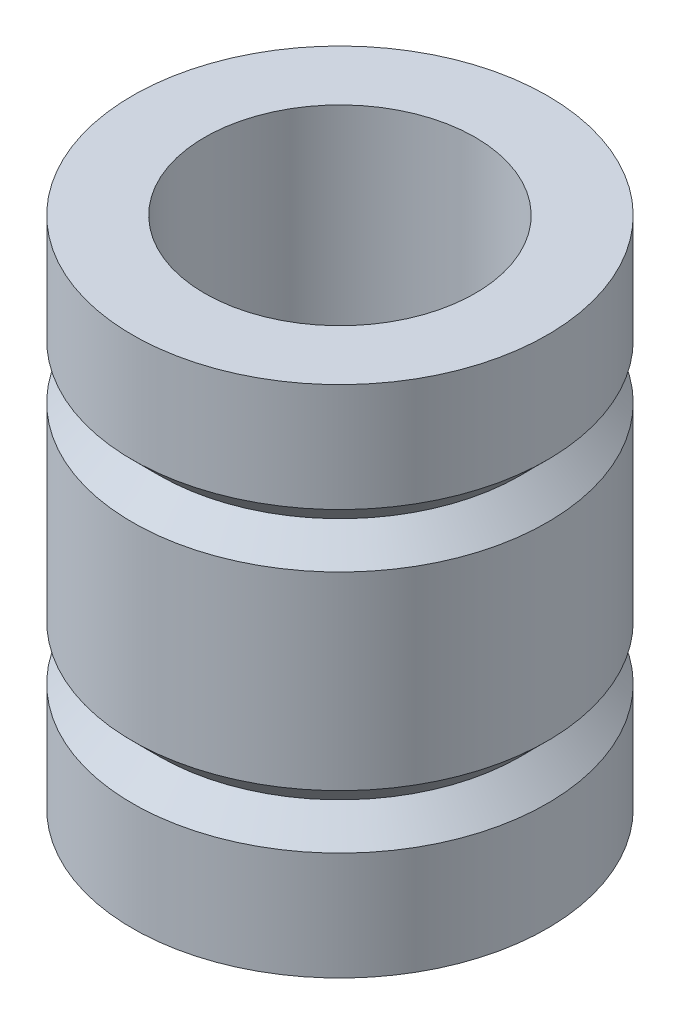
ISO-10303-21;
HEADER;
FILE_DESCRIPTION(('STEP AP214'),'2;1');
FILE_NAME('part.step','',(''),(''),'','','');
FILE_SCHEMA(('AUTOMOTIVE_DESIGN { 1 0 10303 214 1 1 1 1 }'));
ENDSEC;
DATA;
#1=APPLICATION_CONTEXT('core data for automotive mechanical design processes');
#2=APPLICATION_PROTOCOL_DEFINITION('international standard','automotive_design',2000,#1);
#3=PRODUCT_CONTEXT('',#1,'mechanical');
#4=PRODUCT('Part','Part','',(#3));
#5=PRODUCT_RELATED_PRODUCT_CATEGORY('part','',(#4));
#6=PRODUCT_DEFINITION_FORMATION('','',#4);
#7=PRODUCT_DEFINITION_CONTEXT('part definition',#1,'design');
#8=PRODUCT_DEFINITION('design','',#6,#7);
#9=PRODUCT_DEFINITION_SHAPE('','',#8);
#10=(LENGTH_UNIT() NAMED_UNIT(*) SI_UNIT(.MILLI.,.METRE.));
#11=(NAMED_UNIT(*) PLANE_ANGLE_UNIT() SI_UNIT($,.RADIAN.));
#12=(NAMED_UNIT(*) SI_UNIT($,.STERADIAN.) SOLID_ANGLE_UNIT());
#13=UNCERTAINTY_MEASURE_WITH_UNIT(LENGTH_MEASURE(1.E-05),#10,'distance_accuracy_value','');
#14=(GEOMETRIC_REPRESENTATION_CONTEXT(3) GLOBAL_UNCERTAINTY_ASSIGNED_CONTEXT((#13)) GLOBAL_UNIT_ASSIGNED_CONTEXT((#10,
#11,#12)) REPRESENTATION_CONTEXT('',''));
#15=CARTESIAN_POINT('',(0.,0.,0.));
#16=DIRECTION('',(0.,0.,1.));
#17=DIRECTION('',(1.,0.,0.));
#18=AXIS2_PLACEMENT_3D('',#15,#16,#17);
#19=CARTESIAN_POINT('',(0.,-10.,0.));
#20=DIRECTION('',(0.,-1.,0.));
#21=DIRECTION('',(0.,0.,-1.));
#22=AXIS2_PLACEMENT_3D('',#19,#20,#21);
#23=CYLINDRICAL_SURFACE('',#22,1.5);
#24=CARTESIAN_POINT('',(0.,-5.7,0.));
#25=DIRECTION('',(0.,-1.,0.));
#26=DIRECTION('',(0.,0.,-1.));
#27=AXIS2_PLACEMENT_3D('',#24,#25,#26);
#28=CIRCLE('',#27,1.5);
#29=CARTESIAN_POINT('',(0.,-5.7,-1.5));
#30=VERTEX_POINT('',#29);
#31=EDGE_CURVE('E73',#30,#30,#28,.T.);
#32=ORIENTED_EDGE('',*,*,#31,.T.);
#33=EDGE_LOOP('',(#32));
#34=FACE_BOUND('',#33,.T.);
#35=CARTESIAN_POINT('',(0.,0.,0.));
#36=DIRECTION('',(0.,-1.,0.));
#37=DIRECTION('',(0.,0.,-1.));
#38=AXIS2_PLACEMENT_3D('',#35,#36,#37);
#39=CIRCLE('',#38,1.5);
#40=CARTESIAN_POINT('',(0.,0.,-1.5));
#41=VERTEX_POINT('',#40);
#42=EDGE_CURVE('E10',#41,#41,#39,.T.);
#43=ORIENTED_EDGE('',*,*,#42,.F.);
#44=EDGE_LOOP('',(#43));
#45=FACE_BOUND('',#44,.T.);
#46=ADVANCED_FACE('F39',(#34,#45),#23,.F.);
#47=CARTESIAN_POINT('',(1.5,0.,0.));
#48=DIRECTION('',(0.,1.,0.));
#49=DIRECTION('',(0.,0.,1.));
#50=AXIS2_PLACEMENT_3D('',#47,#48,#49);
#51=PLANE('',#50);
#52=ORIENTED_EDGE('',*,*,#42,.T.);
#53=EDGE_LOOP('',(#52));
#54=FACE_BOUND('',#53,.T.);
#55=CARTESIAN_POINT('',(0.,0.,0.));
#56=DIRECTION('',(0.,-1.,0.));
#57=DIRECTION('',(0.,0.,-1.));
#58=AXIS2_PLACEMENT_3D('',#55,#56,#57);
#59=CIRCLE('',#58,2.3);
#60=CARTESIAN_POINT('',(0.,0.,-2.3));
#61=VERTEX_POINT('',#60);
#62=EDGE_CURVE('E45',#61,#61,#59,.T.);
#63=ORIENTED_EDGE('',*,*,#62,.F.);
#64=EDGE_LOOP('',(#63));
#65=FACE_BOUND('',#64,.T.);
#66=ADVANCED_FACE('F91',(#54,#65),#51,.T.);
#67=CARTESIAN_POINT('',(0.,-10.,0.));
#68=DIRECTION('',(0.,-1.,0.));
#69=DIRECTION('',(0.,0.,-1.));
#70=AXIS2_PLACEMENT_3D('',#67,#68,#69);
#71=CYLINDRICAL_SURFACE('',#70,2.3);
#72=ORIENTED_EDGE('',*,*,#62,.T.);
#73=EDGE_LOOP('',(#72));
#74=FACE_BOUND('',#73,.T.);
#75=CARTESIAN_POINT('',(0.,-1.2,0.));
#76=DIRECTION('',(0.,-1.,0.));
#77=DIRECTION('',(0.,0.,-1.));
#78=AXIS2_PLACEMENT_3D('',#75,#76,#77);
#79=CIRCLE('',#78,2.3);
#80=CARTESIAN_POINT('',(0.,-1.2,-2.3));
#81=VERTEX_POINT('',#80);
#82=EDGE_CURVE('E49',#81,#81,#79,.T.);
#83=ORIENTED_EDGE('',*,*,#82,.F.);
#84=EDGE_LOOP('',(#83));
#85=FACE_BOUND('',#84,.T.);
#86=ADVANCED_FACE('F95',(#74,#85),#71,.T.);
#87=CARTESIAN_POINT('',(0.,-1.5,0.));
#88=DIRECTION('',(0.,1.,0.));
#89=DIRECTION('',(0.,0.,1.));
#90=AXIS2_PLACEMENT_3D('',#87,#88,#89);
#91=CONICAL_SURFACE('',#90,2.,0.785398163397448);
#92=ORIENTED_EDGE('',*,*,#82,.T.);
#93=EDGE_LOOP('',(#92));
#94=FACE_BOUND('',#93,.T.);
#95=CARTESIAN_POINT('',(0.,-1.5,0.));
#96=DIRECTION('',(0.,-1.,0.));
#97=DIRECTION('',(0.,0.,-1.));
#98=AXIS2_PLACEMENT_3D('',#95,#96,#97);
#99=CIRCLE('',#98,2.);
#100=CARTESIAN_POINT('',(0.,-1.5,-2.));
#101=VERTEX_POINT('',#100);
#102=EDGE_CURVE('E53',#101,#101,#99,.T.);
#103=ORIENTED_EDGE('',*,*,#102,.F.);
#104=EDGE_LOOP('',(#103));
#105=FACE_BOUND('',#104,.T.);
#106=ADVANCED_FACE('F99',(#94,#105),#91,.T.);
#107=CARTESIAN_POINT('',(0.,-1.8,0.));
#108=DIRECTION('',(0.,-1.,0.));
#109=DIRECTION('',(0.,0.,-1.));
#110=AXIS2_PLACEMENT_3D('',#107,#108,#109);
#111=CONICAL_SURFACE('',#110,2.3,0.785398163397448);
#112=ORIENTED_EDGE('',*,*,#102,.T.);
#113=EDGE_LOOP('',(#112));
#114=FACE_BOUND('',#113,.T.);
#115=CARTESIAN_POINT('',(0.,-1.8,0.));
#116=DIRECTION('',(0.,-1.,0.));
#117=DIRECTION('',(0.,0.,-1.));
#118=AXIS2_PLACEMENT_3D('',#115,#116,#117);
#119=CIRCLE('',#118,2.3);
#120=CARTESIAN_POINT('',(0.,-1.8,-2.3));
#121=VERTEX_POINT('',#120);
#122=EDGE_CURVE('E58',#121,#121,#119,.T.);
#123=ORIENTED_EDGE('',*,*,#122,.F.);
#124=EDGE_LOOP('',(#123));
#125=FACE_BOUND('',#124,.T.);
#126=ADVANCED_FACE('F105',(#114,#125),#111,.T.);
#127=CARTESIAN_POINT('',(0.,-10.,0.));
#128=DIRECTION('',(0.,-1.,0.));
#129=DIRECTION('',(0.,0.,-1.));
#130=AXIS2_PLACEMENT_3D('',#127,#128,#129);
#131=CYLINDRICAL_SURFACE('',#130,2.3);
#132=ORIENTED_EDGE('',*,*,#122,.T.);
#133=EDGE_LOOP('',(#132));
#134=FACE_BOUND('',#133,.T.);
#135=CARTESIAN_POINT('',(0.,-3.9,0.));
#136=DIRECTION('',(0.,-1.,0.));
#137=DIRECTION('',(0.,0.,-1.));
#138=AXIS2_PLACEMENT_3D('',#135,#136,#137);
#139=CIRCLE('',#138,2.3);
#140=CARTESIAN_POINT('',(0.,-3.9,-2.3));
#141=VERTEX_POINT('',#140);
#142=EDGE_CURVE('E61',#141,#141,#139,.T.);
#143=ORIENTED_EDGE('',*,*,#142,.F.);
#144=EDGE_LOOP('',(#143));
#145=FACE_BOUND('',#144,.T.);
#146=ADVANCED_FACE('F109',(#134,#145),#131,.T.);
#147=CARTESIAN_POINT('',(0.,-4.2,0.));
#148=DIRECTION('',(0.,1.,0.));
#149=DIRECTION('',(0.,0.,1.));
#150=AXIS2_PLACEMENT_3D('',#147,#148,#149);
#151=CONICAL_SURFACE('',#150,2.,0.785398163397448);
#152=ORIENTED_EDGE('',*,*,#142,.T.);
#153=EDGE_LOOP('',(#152));
#154=FACE_BOUND('',#153,.T.);
#155=CARTESIAN_POINT('',(0.,-4.2,0.));
#156=DIRECTION('',(0.,-1.,0.));
#157=DIRECTION('',(0.,0.,-1.));
#158=AXIS2_PLACEMENT_3D('',#155,#156,#157);
#159=CIRCLE('',#158,2.);
#160=CARTESIAN_POINT('',(0.,-4.2,-2.));
#161=VERTEX_POINT('',#160);
#162=EDGE_CURVE('E64',#161,#161,#159,.T.);
#163=ORIENTED_EDGE('',*,*,#162,.F.);
#164=EDGE_LOOP('',(#163));
#165=FACE_BOUND('',#164,.T.);
#166=ADVANCED_FACE('F113',(#154,#165),#151,.T.);
#167=CARTESIAN_POINT('',(0.,-4.5,0.));
#168=DIRECTION('',(0.,-1.,0.));
#169=DIRECTION('',(0.,0.,-1.));
#170=AXIS2_PLACEMENT_3D('',#167,#168,#169);
#171=CONICAL_SURFACE('',#170,2.3,0.785398163397448);
#172=ORIENTED_EDGE('',*,*,#162,.T.);
#173=EDGE_LOOP('',(#172));
#174=FACE_BOUND('',#173,.T.);
#175=CARTESIAN_POINT('',(0.,-4.5,0.));
#176=DIRECTION('',(0.,-1.,0.));
#177=DIRECTION('',(0.,0.,-1.));
#178=AXIS2_PLACEMENT_3D('',#175,#176,#177);
#179=CIRCLE('',#178,2.3);
#180=CARTESIAN_POINT('',(0.,-4.5,-2.3));
#181=VERTEX_POINT('',#180);
#182=EDGE_CURVE('E67',#181,#181,#179,.T.);
#183=ORIENTED_EDGE('',*,*,#182,.F.);
#184=EDGE_LOOP('',(#183));
#185=FACE_BOUND('',#184,.T.);
#186=ADVANCED_FACE('F87',(#174,#185),#171,.T.);
#187=CARTESIAN_POINT('',(0.,-10.,0.));
#188=DIRECTION('',(0.,-1.,0.));
#189=DIRECTION('',(0.,0.,-1.));
#190=AXIS2_PLACEMENT_3D('',#187,#188,#189);
#191=CYLINDRICAL_SURFACE('',#190,2.3);
#192=ORIENTED_EDGE('',*,*,#182,.T.);
#193=EDGE_LOOP('',(#192));
#194=FACE_BOUND('',#193,.T.);
#195=CARTESIAN_POINT('',(0.,-5.7,0.));
#196=DIRECTION('',(0.,-1.,0.));
#197=DIRECTION('',(0.,0.,-1.));
#198=AXIS2_PLACEMENT_3D('',#195,#196,#197);
#199=CIRCLE('',#198,2.3);
#200=CARTESIAN_POINT('',(0.,-5.7,-2.3));
#201=VERTEX_POINT('',#200);
#202=EDGE_CURVE('E70',#201,#201,#199,.T.);
#203=ORIENTED_EDGE('',*,*,#202,.F.);
#204=EDGE_LOOP('',(#203));
#205=FACE_BOUND('',#204,.T.);
#206=ADVANCED_FACE('F81',(#194,#205),#191,.T.);
#207=CARTESIAN_POINT('',(2.3,-5.7,0.));
#208=DIRECTION('',(0.,-1.,0.));
#209=DIRECTION('',(0.,0.,-1.));
#210=AXIS2_PLACEMENT_3D('',#207,#208,#209);
#211=PLANE('',#210);
#212=ORIENTED_EDGE('',*,*,#202,.T.);
#213=EDGE_LOOP('',(#212));
#214=FACE_BOUND('',#213,.T.);
#215=ORIENTED_EDGE('',*,*,#31,.F.);
#216=EDGE_LOOP('',(#215));
#217=FACE_BOUND('',#216,.T.);
#218=ADVANCED_FACE('F79',(#214,#217),#211,.T.);
#219=CLOSED_SHELL('',(#46,#66,#86,#106,#126,#146,#166,#186,#206,#218));
#220=MANIFOLD_SOLID_BREP('B2',#219);
#221=ADVANCED_BREP_SHAPE_REPRESENTATION('',(#18,#220),#14);
#222=SHAPE_DEFINITION_REPRESENTATION(#9,#221);
ENDSEC;
END-ISO-10303-21;
